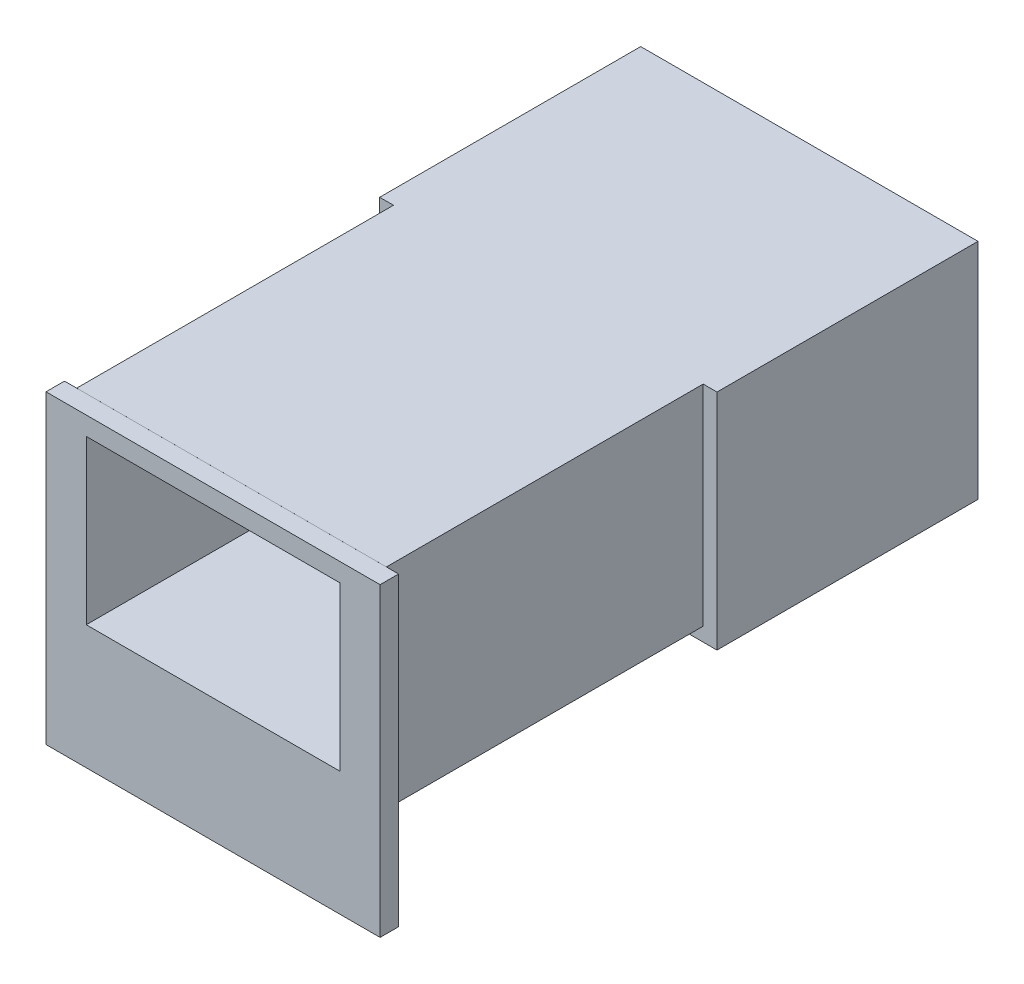
ISO-10303-21;
HEADER;
FILE_DESCRIPTION(('STEP AP214'),'2;1');
FILE_NAME('part.step','',(''),(''),'','','');
FILE_SCHEMA(('AUTOMOTIVE_DESIGN { 1 0 10303 214 1 1 1 1 }'));
ENDSEC;
DATA;
#1=APPLICATION_CONTEXT('core data for automotive mechanical design processes');
#2=APPLICATION_PROTOCOL_DEFINITION('international standard','automotive_design',2000,#1);
#3=PRODUCT_CONTEXT('',#1,'mechanical');
#4=PRODUCT('Part','Part','',(#3));
#5=PRODUCT_RELATED_PRODUCT_CATEGORY('part','',(#4));
#6=PRODUCT_DEFINITION_FORMATION('','',#4);
#7=PRODUCT_DEFINITION_CONTEXT('part definition',#1,'design');
#8=PRODUCT_DEFINITION('design','',#6,#7);
#9=PRODUCT_DEFINITION_SHAPE('','',#8);
#10=(LENGTH_UNIT() NAMED_UNIT(*) SI_UNIT(.MILLI.,.METRE.));
#11=(NAMED_UNIT(*) PLANE_ANGLE_UNIT() SI_UNIT($,.RADIAN.));
#12=(NAMED_UNIT(*) SI_UNIT($,.STERADIAN.) SOLID_ANGLE_UNIT());
#13=UNCERTAINTY_MEASURE_WITH_UNIT(LENGTH_MEASURE(1.E-05),#10,'distance_accuracy_value','');
#14=(GEOMETRIC_REPRESENTATION_CONTEXT(3) GLOBAL_UNCERTAINTY_ASSIGNED_CONTEXT((#13)) GLOBAL_UNIT_ASSIGNED_CONTEXT((#10,
#11,#12)) REPRESENTATION_CONTEXT('',''));
#15=CARTESIAN_POINT('',(0.,0.,0.));
#16=DIRECTION('',(0.,0.,1.));
#17=DIRECTION('',(1.,0.,0.));
#18=AXIS2_PLACEMENT_3D('',#15,#16,#17);
#19=CARTESIAN_POINT('',(0.,0.,41.2));
#20=DIRECTION('',(0.,0.,1.));
#21=DIRECTION('',(1.,0.,0.));
#22=AXIS2_PLACEMENT_3D('',#19,#20,#21);
#23=PLANE('',#22);
#24=DIRECTION('',(1.,0.,0.));
#25=VECTOR('',#24,1.);
#26=CARTESIAN_POINT('',(-34.9518135180335,-15.1526853653145,41.2));
#27=LINE('',#26,#25);
#28=CARTESIAN_POINT('',(-34.9518135180335,-15.1526853653145,41.2));
#29=VERTEX_POINT('',#28);
#30=CARTESIAN_POINT('',(13.9281864819665,-15.1526853653145,41.2));
#31=VERTEX_POINT('',#30);
#32=EDGE_CURVE('E80',#29,#31,#27,.T.);
#33=ORIENTED_EDGE('',*,*,#32,.F.);
#34=DIRECTION('',(0.,1.,0.));
#35=VECTOR('',#34,1.);
#36=CARTESIAN_POINT('',(-34.9518135180335,-15.1526853653145,41.2));
#37=LINE('',#36,#35);
#38=CARTESIAN_POINT('',(-34.9518135180335,17.9473146346855,41.2));
#39=VERTEX_POINT('',#38);
#40=EDGE_CURVE('E274',#29,#39,#37,.T.);
#41=ORIENTED_EDGE('',*,*,#40,.T.);
#42=DIRECTION('',(-1.,0.,0.));
#43=VECTOR('',#42,1.);
#44=CARTESIAN_POINT('',(-37.1318135180335,17.9473146346855,41.2));
#45=LINE('',#44,#43);
#46=CARTESIAN_POINT('',(-37.1318135180335,17.9473146346855,41.2));
#47=VERTEX_POINT('',#46);
#48=EDGE_CURVE('E344',#39,#47,#45,.T.);
#49=ORIENTED_EDGE('',*,*,#48,.T.);
#50=DIRECTION('',(0.,-1.,0.));
#51=VECTOR('',#50,1.);
#52=CARTESIAN_POINT('',(-37.1318135180335,17.9473146346855,41.2));
#53=LINE('',#52,#51);
#54=CARTESIAN_POINT('',(-37.1318135180335,-17.3326853653145,41.2));
#55=VERTEX_POINT('',#54);
#56=EDGE_CURVE('E336',#47,#55,#53,.T.);
#57=ORIENTED_EDGE('',*,*,#56,.T.);
#58=DIRECTION('',(1.,0.,0.));
#59=VECTOR('',#58,1.);
#60=CARTESIAN_POINT('',(-37.1318135180335,-17.3326853653145,41.2));
#61=LINE('',#60,#59);
#62=CARTESIAN_POINT('',(16.1081864819665,-17.3326853653145,41.2));
#63=VERTEX_POINT('',#62);
#64=EDGE_CURVE('E339',#55,#63,#61,.T.);
#65=ORIENTED_EDGE('',*,*,#64,.T.);
#66=DIRECTION('',(0.,1.,0.));
#67=VECTOR('',#66,1.);
#68=CARTESIAN_POINT('',(16.1081864819665,17.9473146346855,41.2));
#69=LINE('',#68,#67);
#70=CARTESIAN_POINT('',(16.1081864819665,17.9473146346855,41.2));
#71=VERTEX_POINT('',#70);
#72=EDGE_CURVE('E342',#63,#71,#69,.T.);
#73=ORIENTED_EDGE('',*,*,#72,.T.);
#74=CARTESIAN_POINT('',(13.9281864819665,17.9473146346855,41.2));
#75=VERTEX_POINT('',#74);
#76=EDGE_CURVE('E345',#71,#75,#45,.T.);
#77=ORIENTED_EDGE('',*,*,#76,.T.);
#78=DIRECTION('',(0.,1.,0.));
#79=VECTOR('',#78,1.);
#80=CARTESIAN_POINT('',(13.9281864819665,-15.1526853653145,41.2));
#81=LINE('',#80,#79);
#82=EDGE_CURVE('E286',#31,#75,#81,.T.);
#83=ORIENTED_EDGE('',*,*,#82,.F.);
#84=EDGE_LOOP('',(#33,#41,#49,#57,#65,#73,#77,#83));
#85=FACE_BOUND('',#84,.T.);
#86=ADVANCED_FACE('F56',(#85),#23,.T.);
#87=CARTESIAN_POINT('',(0.,0.,0.));
#88=DIRECTION('',(0.,0.,1.));
#89=DIRECTION('',(1.,0.,0.));
#90=AXIS2_PLACEMENT_3D('',#87,#88,#89);
#91=PLANE('',#90);
#92=DIRECTION('',(0.,-1.,0.));
#93=VECTOR('',#92,1.);
#94=CARTESIAN_POINT('',(-37.1318135180335,17.9473146346855,0.));
#95=LINE('',#94,#93);
#96=CARTESIAN_POINT('',(-37.1318135180335,17.9473146346855,0.));
#97=VERTEX_POINT('',#96);
#98=CARTESIAN_POINT('',(-37.1318135180335,-17.3326853653145,0.));
#99=VERTEX_POINT('',#98);
#100=EDGE_CURVE('E335',#97,#99,#95,.T.);
#101=ORIENTED_EDGE('',*,*,#100,.F.);
#102=DIRECTION('',(-1.,0.,0.));
#103=VECTOR('',#102,1.);
#104=CARTESIAN_POINT('',(-37.1318135180335,17.9473146346855,0.));
#105=LINE('',#104,#103);
#106=CARTESIAN_POINT('',(16.1081864819665,17.9473146346855,0.));
#107=VERTEX_POINT('',#106);
#108=EDGE_CURVE('E340',#107,#97,#105,.T.);
#109=ORIENTED_EDGE('',*,*,#108,.F.);
#110=DIRECTION('',(0.,1.,0.));
#111=VECTOR('',#110,1.);
#112=CARTESIAN_POINT('',(16.1081864819665,17.9473146346855,0.));
#113=LINE('',#112,#111);
#114=CARTESIAN_POINT('',(16.1081864819665,-17.3326853653145,0.));
#115=VERTEX_POINT('',#114);
#116=EDGE_CURVE('E352',#115,#107,#113,.T.);
#117=ORIENTED_EDGE('',*,*,#116,.F.);
#118=DIRECTION('',(1.,0.,0.));
#119=VECTOR('',#118,1.);
#120=CARTESIAN_POINT('',(-37.1318135180335,-17.3326853653145,0.));
#121=LINE('',#120,#119);
#122=EDGE_CURVE('E350',#99,#115,#121,.T.);
#123=ORIENTED_EDGE('',*,*,#122,.F.);
#124=EDGE_LOOP('',(#101,#109,#117,#123));
#125=FACE_BOUND('',#124,.T.);
#126=DIRECTION('',(0.,-1.,0.));
#127=VECTOR('',#126,1.);
#128=CARTESIAN_POINT('',(-33.9518135180335,15.0273146346855,0.));
#129=LINE('',#128,#127);
#130=CARTESIAN_POINT('',(-33.9518135180335,15.0273146346855,0.));
#131=VERTEX_POINT('',#130);
#132=CARTESIAN_POINT('',(-33.9518135180335,-14.1526853653145,0.));
#133=VERTEX_POINT('',#132);
#134=EDGE_CURVE('E300',#131,#133,#129,.T.);
#135=ORIENTED_EDGE('',*,*,#134,.T.);
#136=DIRECTION('',(1.,0.,0.));
#137=VECTOR('',#136,1.);
#138=CARTESIAN_POINT('',(-33.9518135180335,-14.1526853653145,0.));
#139=LINE('',#138,#137);
#140=CARTESIAN_POINT('',(12.9281864819665,-14.1526853653145,0.));
#141=VERTEX_POINT('',#140);
#142=EDGE_CURVE('E318',#133,#141,#139,.T.);
#143=ORIENTED_EDGE('',*,*,#142,.T.);
#144=DIRECTION('',(0.,1.,0.));
#145=VECTOR('',#144,1.);
#146=CARTESIAN_POINT('',(12.9281864819665,15.0273146346855,0.));
#147=LINE('',#146,#145);
#148=CARTESIAN_POINT('',(12.9281864819665,15.0273146346855,0.));
#149=VERTEX_POINT('',#148);
#150=EDGE_CURVE('E321',#141,#149,#147,.T.);
#151=ORIENTED_EDGE('',*,*,#150,.T.);
#152=DIRECTION('',(-1.,0.,0.));
#153=VECTOR('',#152,1.);
#154=CARTESIAN_POINT('',(-33.9518135180335,15.0273146346855,0.));
#155=LINE('',#154,#153);
#156=EDGE_CURVE('E305',#149,#131,#155,.T.);
#157=ORIENTED_EDGE('',*,*,#156,.T.);
#158=EDGE_LOOP('',(#135,#143,#151,#157));
#159=FACE_BOUND('',#158,.T.);
#160=ADVANCED_FACE('F375',(#125,#159),#91,.F.);
#161=CARTESIAN_POINT('',(-37.1318135180335,17.9473146346855,41.2));
#162=DIRECTION('',(1.,0.,0.));
#163=DIRECTION('',(0.,1.,0.));
#164=AXIS2_PLACEMENT_3D('',#161,#162,#163);
#165=PLANE('',#164);
#166=ORIENTED_EDGE('',*,*,#100,.T.);
#167=DIRECTION('',(0.,0.,-1.));
#168=VECTOR('',#167,1.);
#169=CARTESIAN_POINT('',(-37.1318135180335,-17.3326853653145,41.2));
#170=LINE('',#169,#168);
#171=EDGE_CURVE('E60',#55,#99,#170,.T.);
#172=ORIENTED_EDGE('',*,*,#171,.F.);
#173=ORIENTED_EDGE('',*,*,#56,.F.);
#174=DIRECTION('',(0.,0.,-1.));
#175=VECTOR('',#174,1.);
#176=CARTESIAN_POINT('',(-37.1318135180335,17.9473146346855,41.2));
#177=LINE('',#176,#175);
#178=EDGE_CURVE('E347',#47,#97,#177,.T.);
#179=ORIENTED_EDGE('',*,*,#178,.T.);
#180=EDGE_LOOP('',(#166,#172,#173,#179));
#181=FACE_BOUND('',#180,.T.);
#182=ADVANCED_FACE('F58',(#181),#165,.F.);
#183=CARTESIAN_POINT('',(-37.1318135180335,-17.3326853653145,41.2));
#184=DIRECTION('',(0.,1.,0.));
#185=DIRECTION('',(0.,0.,1.));
#186=AXIS2_PLACEMENT_3D('',#183,#184,#185);
#187=PLANE('',#186);
#188=ORIENTED_EDGE('',*,*,#122,.T.);
#189=DIRECTION('',(0.,0.,-1.));
#190=VECTOR('',#189,1.);
#191=CARTESIAN_POINT('',(16.1081864819665,-17.3326853653145,41.2));
#192=LINE('',#191,#190);
#193=EDGE_CURVE('E359',#63,#115,#192,.T.);
#194=ORIENTED_EDGE('',*,*,#193,.F.);
#195=ORIENTED_EDGE('',*,*,#64,.F.);
#196=ORIENTED_EDGE('',*,*,#171,.T.);
#197=EDGE_LOOP('',(#188,#194,#195,#196));
#198=FACE_BOUND('',#197,.T.);
#199=ADVANCED_FACE('F368',(#198),#187,.F.);
#200=CARTESIAN_POINT('',(16.1081864819665,17.9473146346855,41.2));
#201=DIRECTION('',(-1.,0.,0.));
#202=DIRECTION('',(0.,-1.,0.));
#203=AXIS2_PLACEMENT_3D('',#200,#201,#202);
#204=PLANE('',#203);
#205=ORIENTED_EDGE('',*,*,#116,.T.);
#206=DIRECTION('',(0.,0.,-1.));
#207=VECTOR('',#206,1.);
#208=CARTESIAN_POINT('',(16.1081864819665,17.9473146346855,41.2));
#209=LINE('',#208,#207);
#210=EDGE_CURVE('E357',#71,#107,#209,.T.);
#211=ORIENTED_EDGE('',*,*,#210,.F.);
#212=ORIENTED_EDGE('',*,*,#72,.F.);
#213=ORIENTED_EDGE('',*,*,#193,.T.);
#214=EDGE_LOOP('',(#205,#211,#212,#213));
#215=FACE_BOUND('',#214,.T.);
#216=ADVANCED_FACE('F378',(#215),#204,.F.);
#217=CARTESIAN_POINT('',(-37.1318135180335,17.9473146346855,41.2));
#218=DIRECTION('',(0.,-1.,0.));
#219=DIRECTION('',(0.,0.,-1.));
#220=AXIS2_PLACEMENT_3D('',#217,#218,#219);
#221=PLANE('',#220);
#222=ORIENTED_EDGE('',*,*,#108,.T.);
#223=ORIENTED_EDGE('',*,*,#178,.F.);
#224=ORIENTED_EDGE('',*,*,#48,.F.);
#225=DIRECTION('',(0.,0.,-1.));
#226=VECTOR('',#225,1.);
#227=CARTESIAN_POINT('',(-34.9518135180335,17.9473146346855,91.2));
#228=LINE('',#227,#226);
#229=CARTESIAN_POINT('',(-34.9518135180335,17.9473146346855,91.2));
#230=VERTEX_POINT('',#229);
#231=EDGE_CURVE('E291',#230,#39,#228,.T.);
#232=ORIENTED_EDGE('',*,*,#231,.F.);
#233=DIRECTION('',(1.,0.,0.));
#234=VECTOR('',#233,1.);
#235=CARTESIAN_POINT('',(-34.9518135180335,17.9473146346855,91.2));
#236=LINE('',#235,#234);
#237=CARTESIAN_POINT('',(13.9281864819665,17.9473146346855,91.2));
#238=VERTEX_POINT('',#237);
#239=EDGE_CURVE('E278',#230,#238,#236,.T.);
#240=ORIENTED_EDGE('',*,*,#239,.T.);
#241=DIRECTION('',(0.,0.,-1.));
#242=VECTOR('',#241,1.);
#243=CARTESIAN_POINT('',(13.9281864819665,17.9473146346855,91.2));
#244=LINE('',#243,#242);
#245=EDGE_CURVE('E294',#238,#75,#244,.T.);
#246=ORIENTED_EDGE('',*,*,#245,.T.);
#247=ORIENTED_EDGE('',*,*,#76,.F.);
#248=ORIENTED_EDGE('',*,*,#210,.T.);
#249=EDGE_LOOP('',(#222,#223,#224,#232,#240,#246,#247,#248));
#250=FACE_BOUND('',#249,.T.);
#251=ADVANCED_FACE('F381',(#250),#221,.F.);
#252=CARTESIAN_POINT('',(-33.9518135180335,15.0273146346855,41.2));
#253=DIRECTION('',(1.,0.,0.));
#254=DIRECTION('',(0.,1.,0.));
#255=AXIS2_PLACEMENT_3D('',#252,#253,#254);
#256=PLANE('',#255);
#257=ORIENTED_EDGE('',*,*,#134,.F.);
#258=DIRECTION('',(0.,0.,-1.));
#259=VECTOR('',#258,1.);
#260=CARTESIAN_POINT('',(-33.9518135180335,15.0273146346855,41.2));
#261=LINE('',#260,#259);
#262=CARTESIAN_POINT('',(-33.9518135180335,15.0273146346855,41.2));
#263=VERTEX_POINT('',#262);
#264=EDGE_CURVE('E315',#263,#131,#261,.T.);
#265=ORIENTED_EDGE('',*,*,#264,.F.);
#266=DIRECTION('',(0.,-1.,0.));
#267=VECTOR('',#266,1.);
#268=CARTESIAN_POINT('',(-33.9518135180335,15.0273146346855,41.2));
#269=LINE('',#268,#267);
#270=CARTESIAN_POINT('',(-33.9518135180335,-14.1526853653145,41.2));
#271=VERTEX_POINT('',#270);
#272=EDGE_CURVE('E301',#263,#271,#269,.T.);
#273=ORIENTED_EDGE('',*,*,#272,.T.);
#274=DIRECTION('',(0.,0.,-1.));
#275=VECTOR('',#274,1.);
#276=CARTESIAN_POINT('',(-33.9518135180335,-14.1526853653145,41.2));
#277=LINE('',#276,#275);
#278=EDGE_CURVE('E332',#271,#133,#277,.T.);
#279=ORIENTED_EDGE('',*,*,#278,.T.);
#280=EDGE_LOOP('',(#257,#265,#273,#279));
#281=FACE_BOUND('',#280,.T.);
#282=ADVANCED_FACE('F425',(#281),#256,.T.);
#283=CARTESIAN_POINT('',(-33.9518135180335,-14.1526853653145,41.2));
#284=DIRECTION('',(0.,1.,0.));
#285=DIRECTION('',(0.,0.,1.));
#286=AXIS2_PLACEMENT_3D('',#283,#284,#285);
#287=PLANE('',#286);
#288=ORIENTED_EDGE('',*,*,#142,.F.);
#289=ORIENTED_EDGE('',*,*,#278,.F.);
#290=DIRECTION('',(1.,0.,0.));
#291=VECTOR('',#290,1.);
#292=CARTESIAN_POINT('',(-33.9518135180335,-14.1526853653145,41.2));
#293=LINE('',#292,#291);
#294=CARTESIAN_POINT('',(12.9281864819665,-14.1526853653145,41.2));
#295=VERTEX_POINT('',#294);
#296=EDGE_CURVE('E304',#271,#295,#293,.T.);
#297=ORIENTED_EDGE('',*,*,#296,.T.);
#298=DIRECTION('',(0.,0.,-1.));
#299=VECTOR('',#298,1.);
#300=CARTESIAN_POINT('',(12.9281864819665,-14.1526853653145,41.2));
#301=LINE('',#300,#299);
#302=EDGE_CURVE('E330',#295,#141,#301,.T.);
#303=ORIENTED_EDGE('',*,*,#302,.T.);
#304=EDGE_LOOP('',(#288,#289,#297,#303));
#305=FACE_BOUND('',#304,.T.);
#306=ADVANCED_FACE('F471',(#305),#287,.T.);
#307=CARTESIAN_POINT('',(12.9281864819665,15.0273146346855,41.2));
#308=DIRECTION('',(-1.,0.,0.));
#309=DIRECTION('',(0.,-1.,0.));
#310=AXIS2_PLACEMENT_3D('',#307,#308,#309);
#311=PLANE('',#310);
#312=ORIENTED_EDGE('',*,*,#150,.F.);
#313=ORIENTED_EDGE('',*,*,#302,.F.);
#314=DIRECTION('',(0.,1.,0.));
#315=VECTOR('',#314,1.);
#316=CARTESIAN_POINT('',(12.9281864819665,15.0273146346855,41.2));
#317=LINE('',#316,#315);
#318=CARTESIAN_POINT('',(12.9281864819665,15.0273146346855,41.2));
#319=VERTEX_POINT('',#318);
#320=EDGE_CURVE('E308',#295,#319,#317,.T.);
#321=ORIENTED_EDGE('',*,*,#320,.T.);
#322=DIRECTION('',(0.,0.,-1.));
#323=VECTOR('',#322,1.);
#324=CARTESIAN_POINT('',(12.9281864819665,15.0273146346855,41.2));
#325=LINE('',#324,#323);
#326=EDGE_CURVE('E328',#319,#149,#325,.T.);
#327=ORIENTED_EDGE('',*,*,#326,.T.);
#328=EDGE_LOOP('',(#312,#313,#321,#327));
#329=FACE_BOUND('',#328,.T.);
#330=ADVANCED_FACE('F479',(#329),#311,.T.);
#331=CARTESIAN_POINT('',(-33.9518135180335,15.0273146346855,41.2));
#332=DIRECTION('',(0.,-1.,0.));
#333=DIRECTION('',(0.,0.,-1.));
#334=AXIS2_PLACEMENT_3D('',#331,#332,#333);
#335=PLANE('',#334);
#336=ORIENTED_EDGE('',*,*,#156,.F.);
#337=ORIENTED_EDGE('',*,*,#326,.F.);
#338=DIRECTION('',(-1.,0.,0.));
#339=VECTOR('',#338,1.);
#340=CARTESIAN_POINT('',(-33.9518135180335,15.0273146346855,41.2));
#341=LINE('',#340,#339);
#342=CARTESIAN_POINT('',(9.49818648196652,15.0273146346855,41.2));
#343=VERTEX_POINT('',#342);
#344=EDGE_CURVE('E312',#319,#343,#341,.T.);
#345=ORIENTED_EDGE('',*,*,#344,.T.);
#346=DIRECTION('',(0.,0.,-1.));
#347=VECTOR('',#346,1.);
#348=CARTESIAN_POINT('',(9.49818648196652,15.0273146346855,91.2));
#349=LINE('',#348,#347);
#350=CARTESIAN_POINT('',(9.49818648196652,15.0273146346855,94.12));
#351=VERTEX_POINT('',#350);
#352=EDGE_CURVE('E266',#351,#343,#349,.T.);
#353=ORIENTED_EDGE('',*,*,#352,.F.);
#354=DIRECTION('',(-1.,0.,0.));
#355=VECTOR('',#354,1.);
#356=CARTESIAN_POINT('',(-30.5218135180335,15.0273146346855,94.12));
#357=LINE('',#356,#355);
#358=CARTESIAN_POINT('',(-30.5218135180335,15.0273146346855,94.12));
#359=VERTEX_POINT('',#358);
#360=EDGE_CURVE('E227',#351,#359,#357,.T.);
#361=ORIENTED_EDGE('',*,*,#360,.T.);
#362=DIRECTION('',(0.,0.,-1.));
#363=VECTOR('',#362,1.);
#364=CARTESIAN_POINT('',(-30.5218135180335,15.0273146346855,91.2));
#365=LINE('',#364,#363);
#366=CARTESIAN_POINT('',(-30.5218135180335,15.0273146346855,41.2));
#367=VERTEX_POINT('',#366);
#368=EDGE_CURVE('E212',#359,#367,#365,.T.);
#369=ORIENTED_EDGE('',*,*,#368,.T.);
#370=EDGE_CURVE('E311',#367,#263,#341,.T.);
#371=ORIENTED_EDGE('',*,*,#370,.T.);
#372=ORIENTED_EDGE('',*,*,#264,.T.);
#373=EDGE_LOOP('',(#336,#337,#345,#353,#361,#369,#371,#372));
#374=FACE_BOUND('',#373,.T.);
#375=ADVANCED_FACE('F487',(#374),#335,.T.);
#376=CARTESIAN_POINT('',(0.,0.,91.2));
#377=DIRECTION('',(0.,0.,1.));
#378=DIRECTION('',(1.,0.,0.));
#379=AXIS2_PLACEMENT_3D('',#376,#377,#378);
#380=PLANE('',#379);
#381=DIRECTION('',(-1.,0.,0.));
#382=VECTOR('',#381,1.);
#383=CARTESIAN_POINT('',(15.8531864819665,17.9453146346855,91.2));
#384=LINE('',#383,#382);
#385=CARTESIAN_POINT('',(13.9281864819665,17.9453146346855,91.2));
#386=VERTEX_POINT('',#385);
#387=CARTESIAN_POINT('',(-34.9518135180335,17.9453146346855,91.2));
#388=VERTEX_POINT('',#387);
#389=EDGE_CURVE('E12',#386,#388,#384,.T.);
#390=ORIENTED_EDGE('',*,*,#389,.F.);
#391=DIRECTION('',(0.,1.,0.));
#392=VECTOR('',#391,1.);
#393=CARTESIAN_POINT('',(13.9281864819665,-15.1526853653145,91.2));
#394=LINE('',#393,#392);
#395=EDGE_CURVE('E273',#386,#238,#394,.T.);
#396=ORIENTED_EDGE('',*,*,#395,.T.);
#397=ORIENTED_EDGE('',*,*,#239,.F.);
#398=DIRECTION('',(0.,1.,0.));
#399=VECTOR('',#398,1.);
#400=CARTESIAN_POINT('',(-34.9518135180335,-15.1526853653145,91.2));
#401=LINE('',#400,#399);
#402=EDGE_CURVE('E281',#388,#230,#401,.T.);
#403=ORIENTED_EDGE('',*,*,#402,.F.);
#404=EDGE_LOOP('',(#390,#396,#397,#403));
#405=FACE_BOUND('',#404,.T.);
#406=ADVANCED_FACE('F391',(#405),#380,.T.);
#407=CARTESIAN_POINT('',(0.,0.,41.2));
#408=DIRECTION('',(0.,0.,1.));
#409=DIRECTION('',(1.,0.,0.));
#410=AXIS2_PLACEMENT_3D('',#407,#408,#409);
#411=PLANE('',#410);
#412=ORIENTED_EDGE('',*,*,#370,.F.);
#413=DIRECTION('',(0.,-1.,0.));
#414=VECTOR('',#413,1.);
#415=CARTESIAN_POINT('',(-30.5218135180335,15.0273146346855,41.2));
#416=LINE('',#415,#414);
#417=CARTESIAN_POINT('',(-30.5218135180335,-10.7226853653145,41.2));
#418=VERTEX_POINT('',#417);
#419=EDGE_CURVE('E260',#367,#418,#416,.T.);
#420=ORIENTED_EDGE('',*,*,#419,.T.);
#421=DIRECTION('',(-1.,0.,0.));
#422=VECTOR('',#421,1.);
#423=CARTESIAN_POINT('',(9.49818648196652,-10.7226853653145,41.2));
#424=LINE('',#423,#422);
#425=CARTESIAN_POINT('',(9.49818648196652,-10.7226853653145,41.2));
#426=VERTEX_POINT('',#425);
#427=EDGE_CURVE('E208',#426,#418,#424,.T.);
#428=ORIENTED_EDGE('',*,*,#427,.F.);
#429=DIRECTION('',(0.,-1.,0.));
#430=VECTOR('',#429,1.);
#431=CARTESIAN_POINT('',(9.49818648196652,15.0273146346855,41.2));
#432=LINE('',#431,#430);
#433=EDGE_CURVE('E263',#343,#426,#432,.T.);
#434=ORIENTED_EDGE('',*,*,#433,.F.);
#435=ORIENTED_EDGE('',*,*,#344,.F.);
#436=ORIENTED_EDGE('',*,*,#320,.F.);
#437=ORIENTED_EDGE('',*,*,#296,.F.);
#438=ORIENTED_EDGE('',*,*,#272,.F.);
#439=EDGE_LOOP('',(#412,#420,#428,#434,#435,#436,#437,#438));
#440=FACE_BOUND('',#439,.T.);
#441=ADVANCED_FACE('F408',(#440),#411,.F.);
#442=CARTESIAN_POINT('',(-34.9518135180335,-15.1526853653145,91.2));
#443=DIRECTION('',(0.,1.,0.));
#444=DIRECTION('',(0.,0.,1.));
#445=AXIS2_PLACEMENT_3D('',#442,#443,#444);
#446=PLANE('',#445);
#447=ORIENTED_EDGE('',*,*,#32,.T.);
#448=DIRECTION('',(0.,0.,-1.));
#449=VECTOR('',#448,1.);
#450=CARTESIAN_POINT('',(13.9281864819665,-15.1526853653145,91.2));
#451=LINE('',#450,#449);
#452=CARTESIAN_POINT('',(13.9281864819665,-15.1526853653145,91.2));
#453=VERTEX_POINT('',#452);
#454=EDGE_CURVE('E297',#453,#31,#451,.T.);
#455=ORIENTED_EDGE('',*,*,#454,.F.);
#456=DIRECTION('',(1.,0.,0.));
#457=VECTOR('',#456,1.);
#458=CARTESIAN_POINT('',(-34.9518135180335,-15.1526853653145,91.2));
#459=LINE('',#458,#457);
#460=CARTESIAN_POINT('',(-34.9518135180335,-15.1526853653145,91.2));
#461=VERTEX_POINT('',#460);
#462=EDGE_CURVE('E270',#461,#453,#459,.T.);
#463=ORIENTED_EDGE('',*,*,#462,.F.);
#464=DIRECTION('',(0.,0.,-1.));
#465=VECTOR('',#464,1.);
#466=CARTESIAN_POINT('',(-34.9518135180335,-15.1526853653145,91.2));
#467=LINE('',#466,#465);
#468=EDGE_CURVE('E284',#461,#29,#467,.T.);
#469=ORIENTED_EDGE('',*,*,#468,.T.);
#470=EDGE_LOOP('',(#447,#455,#463,#469));
#471=FACE_BOUND('',#470,.T.);
#472=ADVANCED_FACE('F406',(#471),#446,.F.);
#473=CARTESIAN_POINT('',(13.9281864819665,-15.1526853653145,91.2));
#474=DIRECTION('',(-1.,0.,0.));
#475=DIRECTION('',(0.,0.,1.));
#476=AXIS2_PLACEMENT_3D('',#473,#474,#475);
#477=PLANE('',#476);
#478=ORIENTED_EDGE('',*,*,#82,.T.);
#479=ORIENTED_EDGE('',*,*,#245,.F.);
#480=ORIENTED_EDGE('',*,*,#395,.F.);
#481=EDGE_CURVE('E275',#453,#386,#394,.T.);
#482=ORIENTED_EDGE('',*,*,#481,.F.);
#483=ORIENTED_EDGE('',*,*,#454,.T.);
#484=EDGE_LOOP('',(#478,#479,#480,#482,#483));
#485=FACE_BOUND('',#484,.T.);
#486=ADVANCED_FACE('F404',(#485),#477,.F.);
#487=CARTESIAN_POINT('',(-34.9518135180335,-15.1526853653145,91.2));
#488=DIRECTION('',(-1.,0.,0.));
#489=DIRECTION('',(0.,0.,1.));
#490=AXIS2_PLACEMENT_3D('',#487,#488,#489);
#491=PLANE('',#490);
#492=ORIENTED_EDGE('',*,*,#40,.F.);
#493=ORIENTED_EDGE('',*,*,#468,.F.);
#494=EDGE_CURVE('E282',#461,#388,#401,.T.);
#495=ORIENTED_EDGE('',*,*,#494,.T.);
#496=ORIENTED_EDGE('',*,*,#402,.T.);
#497=ORIENTED_EDGE('',*,*,#231,.T.);
#498=EDGE_LOOP('',(#492,#493,#495,#496,#497));
#499=FACE_BOUND('',#498,.T.);
#500=ADVANCED_FACE('F388',(#499),#491,.T.);
#501=CARTESIAN_POINT('',(-30.5218135180335,15.0273146346855,91.2));
#502=DIRECTION('',(1.,0.,0.));
#503=DIRECTION('',(0.,1.,0.));
#504=AXIS2_PLACEMENT_3D('',#501,#502,#503);
#505=PLANE('',#504);
#506=ORIENTED_EDGE('',*,*,#419,.F.);
#507=ORIENTED_EDGE('',*,*,#368,.F.);
#508=DIRECTION('',(0.,-1.,0.));
#509=VECTOR('',#508,1.);
#510=CARTESIAN_POINT('',(-30.5218135180335,15.0273146346855,94.12));
#511=LINE('',#510,#509);
#512=CARTESIAN_POINT('',(-30.5218135180335,-10.7226853653145,94.12));
#513=VERTEX_POINT('',#512);
#514=EDGE_CURVE('E216',#359,#513,#511,.T.);
#515=ORIENTED_EDGE('',*,*,#514,.T.);
#516=DIRECTION('',(0.,0.,-1.));
#517=VECTOR('',#516,1.);
#518=CARTESIAN_POINT('',(-30.5218135180335,-10.7226853653145,91.2));
#519=LINE('',#518,#517);
#520=EDGE_CURVE('E201',#513,#418,#519,.T.);
#521=ORIENTED_EDGE('',*,*,#520,.T.);
#522=EDGE_LOOP('',(#506,#507,#515,#521));
#523=FACE_BOUND('',#522,.T.);
#524=ADVANCED_FACE('F217',(#523),#505,.T.);
#525=CARTESIAN_POINT('',(9.49818648196652,-10.7226853653145,91.2));
#526=DIRECTION('',(0.,-1.,0.));
#527=DIRECTION('',(1.,0.,0.));
#528=AXIS2_PLACEMENT_3D('',#525,#526,#527);
#529=PLANE('',#528);
#530=ORIENTED_EDGE('',*,*,#427,.T.);
#531=ORIENTED_EDGE('',*,*,#520,.F.);
#532=DIRECTION('',(1.,0.,0.));
#533=VECTOR('',#532,1.);
#534=CARTESIAN_POINT('',(-30.5218135180335,-10.7226853653145,94.12));
#535=LINE('',#534,#533);
#536=CARTESIAN_POINT('',(9.49818648196652,-10.7226853653145,94.12));
#537=VERTEX_POINT('',#536);
#538=EDGE_CURVE('E205',#513,#537,#535,.T.);
#539=ORIENTED_EDGE('',*,*,#538,.T.);
#540=DIRECTION('',(0.,0.,-1.));
#541=VECTOR('',#540,1.);
#542=CARTESIAN_POINT('',(9.49818648196652,-10.7226853653145,91.2));
#543=LINE('',#542,#541);
#544=EDGE_CURVE('E213',#537,#426,#543,.T.);
#545=ORIENTED_EDGE('',*,*,#544,.T.);
#546=EDGE_LOOP('',(#530,#531,#539,#545));
#547=FACE_BOUND('',#546,.T.);
#548=ADVANCED_FACE('F203',(#547),#529,.F.);
#549=CARTESIAN_POINT('',(9.49818648196652,15.0273146346855,91.2));
#550=DIRECTION('',(1.,0.,0.));
#551=DIRECTION('',(0.,1.,0.));
#552=AXIS2_PLACEMENT_3D('',#549,#550,#551);
#553=PLANE('',#552);
#554=ORIENTED_EDGE('',*,*,#433,.T.);
#555=ORIENTED_EDGE('',*,*,#544,.F.);
#556=DIRECTION('',(0.,1.,0.));
#557=VECTOR('',#556,1.);
#558=CARTESIAN_POINT('',(9.49818648196652,15.0273146346855,94.12));
#559=LINE('',#558,#557);
#560=EDGE_CURVE('E225',#537,#351,#559,.T.);
#561=ORIENTED_EDGE('',*,*,#560,.T.);
#562=ORIENTED_EDGE('',*,*,#352,.T.);
#563=EDGE_LOOP('',(#554,#555,#561,#562));
#564=FACE_BOUND('',#563,.T.);
#565=ADVANCED_FACE('F555',(#564),#553,.F.);
#566=CARTESIAN_POINT('',(0.,0.,91.2));
#567=DIRECTION('',(0.,0.,1.));
#568=DIRECTION('',(1.,0.,0.));
#569=AXIS2_PLACEMENT_3D('',#566,#567,#568);
#570=PLANE('',#569);
#571=ORIENTED_EDGE('',*,*,#462,.T.);
#572=ORIENTED_EDGE('',*,*,#481,.T.);
#573=CARTESIAN_POINT('',(15.8531864819665,17.9453146346855,91.2));
#574=VERTEX_POINT('',#573);
#575=EDGE_CURVE('E66',#574,#386,#384,.T.);
#576=ORIENTED_EDGE('',*,*,#575,.F.);
#577=DIRECTION('',(0.,1.,0.));
#578=VECTOR('',#577,1.);
#579=CARTESIAN_POINT('',(15.8531864819665,-30.2746853653145,91.2));
#580=LINE('',#579,#578);
#581=CARTESIAN_POINT('',(15.8531864819665,-30.2746853653145,91.2));
#582=VERTEX_POINT('',#581);
#583=EDGE_CURVE('E231',#582,#574,#580,.T.);
#584=ORIENTED_EDGE('',*,*,#583,.F.);
#585=DIRECTION('',(1.,0.,0.));
#586=VECTOR('',#585,1.);
#587=CARTESIAN_POINT('',(15.8531864819665,-30.2746853653145,91.2));
#588=LINE('',#587,#586);
#589=CARTESIAN_POINT('',(-36.8768135180335,-30.2746853653145,91.2));
#590=VERTEX_POINT('',#589);
#591=EDGE_CURVE('E236',#590,#582,#588,.T.);
#592=ORIENTED_EDGE('',*,*,#591,.F.);
#593=DIRECTION('',(0.,-1.,0.));
#594=VECTOR('',#593,1.);
#595=CARTESIAN_POINT('',(-36.8768135180335,-30.2746853653145,91.2));
#596=LINE('',#595,#594);
#597=CARTESIAN_POINT('',(-36.8768135180335,17.9453146346855,91.2));
#598=VERTEX_POINT('',#597);
#599=EDGE_CURVE('E246',#598,#590,#596,.T.);
#600=ORIENTED_EDGE('',*,*,#599,.F.);
#601=EDGE_CURVE('E67',#388,#598,#384,.T.);
#602=ORIENTED_EDGE('',*,*,#601,.F.);
#603=ORIENTED_EDGE('',*,*,#494,.F.);
#604=EDGE_LOOP('',(#571,#572,#576,#584,#592,#600,#602,#603));
#605=FACE_BOUND('',#604,.T.);
#606=ADVANCED_FACE('F394',(#605),#570,.F.);
#607=CARTESIAN_POINT('',(0.,0.,94.12));
#608=DIRECTION('',(0.,0.,1.));
#609=DIRECTION('',(1.,0.,0.));
#610=AXIS2_PLACEMENT_3D('',#607,#608,#609);
#611=PLANE('',#610);
#612=DIRECTION('',(0.,1.,0.));
#613=VECTOR('',#612,1.);
#614=CARTESIAN_POINT('',(15.8531864819665,-30.2746853653145,94.12));
#615=LINE('',#614,#613);
#616=CARTESIAN_POINT('',(15.8531864819665,-30.2746853653145,94.12));
#617=VERTEX_POINT('',#616);
#618=CARTESIAN_POINT('',(15.8531864819665,17.9453146346855,94.12));
#619=VERTEX_POINT('',#618);
#620=EDGE_CURVE('E232',#617,#619,#615,.T.);
#621=ORIENTED_EDGE('',*,*,#620,.T.);
#622=DIRECTION('',(-1.,0.,0.));
#623=VECTOR('',#622,1.);
#624=CARTESIAN_POINT('',(15.8531864819665,17.9453146346855,94.12));
#625=LINE('',#624,#623);
#626=CARTESIAN_POINT('',(-36.8768135180335,17.9453146346855,94.12));
#627=VERTEX_POINT('',#626);
#628=EDGE_CURVE('E235',#619,#627,#625,.T.);
#629=ORIENTED_EDGE('',*,*,#628,.T.);
#630=DIRECTION('',(0.,-1.,0.));
#631=VECTOR('',#630,1.);
#632=CARTESIAN_POINT('',(-36.8768135180335,-30.2746853653145,94.12));
#633=LINE('',#632,#631);
#634=CARTESIAN_POINT('',(-36.8768135180335,-30.2746853653145,94.12));
#635=VERTEX_POINT('',#634);
#636=EDGE_CURVE('E238',#627,#635,#633,.T.);
#637=ORIENTED_EDGE('',*,*,#636,.T.);
#638=DIRECTION('',(1.,0.,0.));
#639=VECTOR('',#638,1.);
#640=CARTESIAN_POINT('',(15.8531864819665,-30.2746853653145,94.12));
#641=LINE('',#640,#639);
#642=EDGE_CURVE('E240',#635,#617,#641,.T.);
#643=ORIENTED_EDGE('',*,*,#642,.T.);
#644=EDGE_LOOP('',(#621,#629,#637,#643));
#645=FACE_BOUND('',#644,.T.);
#646=ORIENTED_EDGE('',*,*,#538,.F.);
#647=ORIENTED_EDGE('',*,*,#514,.F.);
#648=ORIENTED_EDGE('',*,*,#360,.F.);
#649=ORIENTED_EDGE('',*,*,#560,.F.);
#650=EDGE_LOOP('',(#646,#647,#648,#649));
#651=FACE_BOUND('',#650,.T.);
#652=ADVANCED_FACE('F223',(#645,#651),#611,.T.);
#653=CARTESIAN_POINT('',(15.8531864819665,-30.2746853653145,94.12));
#654=DIRECTION('',(-1.,0.,0.));
#655=DIRECTION('',(0.,0.,1.));
#656=AXIS2_PLACEMENT_3D('',#653,#654,#655);
#657=PLANE('',#656);
#658=ORIENTED_EDGE('',*,*,#583,.T.);
#659=DIRECTION('',(0.,0.,-1.));
#660=VECTOR('',#659,1.);
#661=CARTESIAN_POINT('',(15.8531864819665,17.9453146346855,94.12));
#662=LINE('',#661,#660);
#663=EDGE_CURVE('E257',#619,#574,#662,.T.);
#664=ORIENTED_EDGE('',*,*,#663,.F.);
#665=ORIENTED_EDGE('',*,*,#620,.F.);
#666=DIRECTION('',(0.,0.,-1.));
#667=VECTOR('',#666,1.);
#668=CARTESIAN_POINT('',(15.8531864819665,-30.2746853653145,94.12));
#669=LINE('',#668,#667);
#670=EDGE_CURVE('E242',#617,#582,#669,.T.);
#671=ORIENTED_EDGE('',*,*,#670,.T.);
#672=EDGE_LOOP('',(#658,#664,#665,#671));
#673=FACE_BOUND('',#672,.T.);
#674=ADVANCED_FACE('F585',(#673),#657,.F.);
#675=CARTESIAN_POINT('',(15.8531864819665,17.9453146346855,94.12));
#676=DIRECTION('',(0.,-1.,0.));
#677=DIRECTION('',(1.,0.,0.));
#678=AXIS2_PLACEMENT_3D('',#675,#676,#677);
#679=PLANE('',#678);
#680=ORIENTED_EDGE('',*,*,#575,.T.);
#681=ORIENTED_EDGE('',*,*,#389,.T.);
#682=ORIENTED_EDGE('',*,*,#601,.T.);
#683=DIRECTION('',(0.,0.,-1.));
#684=VECTOR('',#683,1.);
#685=CARTESIAN_POINT('',(-36.8768135180335,17.9453146346855,94.12));
#686=LINE('',#685,#684);
#687=EDGE_CURVE('E254',#627,#598,#686,.T.);
#688=ORIENTED_EDGE('',*,*,#687,.F.);
#689=ORIENTED_EDGE('',*,*,#628,.F.);
#690=ORIENTED_EDGE('',*,*,#663,.T.);
#691=EDGE_LOOP('',(#680,#681,#682,#688,#689,#690));
#692=FACE_BOUND('',#691,.T.);
#693=ADVANCED_FACE('F398',(#692),#679,.F.);
#694=CARTESIAN_POINT('',(-36.8768135180335,-30.2746853653145,94.12));
#695=DIRECTION('',(1.,0.,0.));
#696=DIRECTION('',(0.,1.,0.));
#697=AXIS2_PLACEMENT_3D('',#694,#695,#696);
#698=PLANE('',#697);
#699=ORIENTED_EDGE('',*,*,#599,.T.);
#700=DIRECTION('',(0.,0.,-1.));
#701=VECTOR('',#700,1.);
#702=CARTESIAN_POINT('',(-36.8768135180335,-30.2746853653145,94.12));
#703=LINE('',#702,#701);
#704=EDGE_CURVE('E251',#635,#590,#703,.T.);
#705=ORIENTED_EDGE('',*,*,#704,.F.);
#706=ORIENTED_EDGE('',*,*,#636,.F.);
#707=ORIENTED_EDGE('',*,*,#687,.T.);
#708=EDGE_LOOP('',(#699,#705,#706,#707));
#709=FACE_BOUND('',#708,.T.);
#710=ADVANCED_FACE('F602',(#709),#698,.F.);
#711=CARTESIAN_POINT('',(15.8531864819665,-30.2746853653145,94.12));
#712=DIRECTION('',(0.,1.,0.));
#713=DIRECTION('',(-1.,0.,0.));
#714=AXIS2_PLACEMENT_3D('',#711,#712,#713);
#715=PLANE('',#714);
#716=ORIENTED_EDGE('',*,*,#591,.T.);
#717=ORIENTED_EDGE('',*,*,#670,.F.);
#718=ORIENTED_EDGE('',*,*,#642,.F.);
#719=ORIENTED_EDGE('',*,*,#704,.T.);
#720=EDGE_LOOP('',(#716,#717,#718,#719));
#721=FACE_BOUND('',#720,.T.);
#722=ADVANCED_FACE('F610',(#721),#715,.F.);
#723=CLOSED_SHELL('',(#86,#160,#182,#199,#216,#251,#282,#306,#330,#375,#406,#441,#472,#486,#500,
#524,#548,#565,#606,#652,#674,#693,#710,#722));
#724=MANIFOLD_SOLID_BREP('B2',#723);
#725=ADVANCED_BREP_SHAPE_REPRESENTATION('',(#18,#724),#14);
#726=SHAPE_DEFINITION_REPRESENTATION(#9,#725);
ENDSEC;
END-ISO-10303-21;
